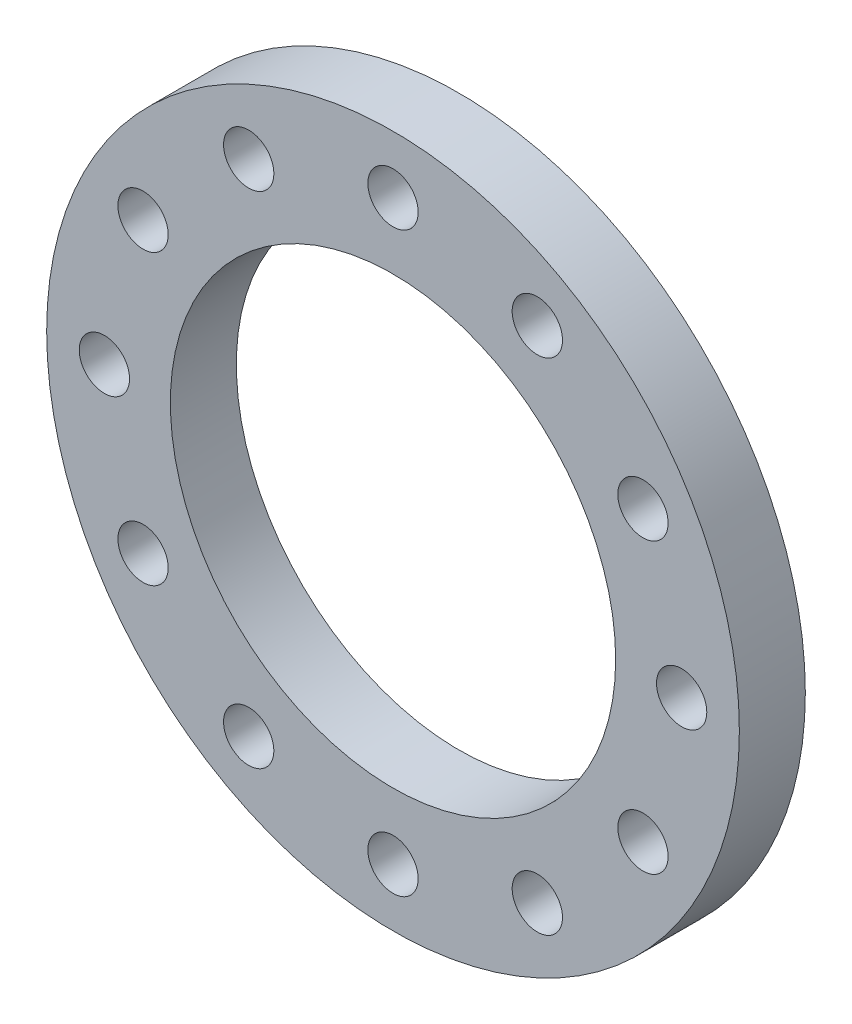
ISO-10303-21;
HEADER;
FILE_DESCRIPTION(('STEP AP214'),'2;1');
FILE_NAME('part.step','',(''),(''),'','','');
FILE_SCHEMA(('AUTOMOTIVE_DESIGN { 1 0 10303 214 1 1 1 1 }'));
ENDSEC;
DATA;
#1=APPLICATION_CONTEXT('core data for automotive mechanical design processes');
#2=APPLICATION_PROTOCOL_DEFINITION('international standard','automotive_design',2000,#1);
#3=PRODUCT_CONTEXT('',#1,'mechanical');
#4=PRODUCT('Part','Part','',(#3));
#5=PRODUCT_RELATED_PRODUCT_CATEGORY('part','',(#4));
#6=PRODUCT_DEFINITION_FORMATION('','',#4);
#7=PRODUCT_DEFINITION_CONTEXT('part definition',#1,'design');
#8=PRODUCT_DEFINITION('design','',#6,#7);
#9=PRODUCT_DEFINITION_SHAPE('','',#8);
#10=(LENGTH_UNIT() NAMED_UNIT(*) SI_UNIT(.MILLI.,.METRE.));
#11=(NAMED_UNIT(*) PLANE_ANGLE_UNIT() SI_UNIT($,.RADIAN.));
#12=(NAMED_UNIT(*) SI_UNIT($,.STERADIAN.) SOLID_ANGLE_UNIT());
#13=UNCERTAINTY_MEASURE_WITH_UNIT(LENGTH_MEASURE(1.E-05),#10,'distance_accuracy_value','');
#14=(GEOMETRIC_REPRESENTATION_CONTEXT(3) GLOBAL_UNCERTAINTY_ASSIGNED_CONTEXT((#13)) GLOBAL_UNIT_ASSIGNED_CONTEXT((#10,
#11,#12)) REPRESENTATION_CONTEXT('',''));
#15=CARTESIAN_POINT('',(0.,0.,0.));
#16=DIRECTION('',(0.,0.,1.));
#17=DIRECTION('',(1.,0.,0.));
#18=AXIS2_PLACEMENT_3D('',#15,#16,#17);
#19=CARTESIAN_POINT('',(0.,0.,4.));
#20=DIRECTION('',(0.,0.,1.));
#21=DIRECTION('',(1.,0.,0.));
#22=AXIS2_PLACEMENT_3D('',#19,#20,#21);
#23=PLANE('',#22);
#24=CARTESIAN_POINT('',(15.1554445662292,8.74999999999743,4.));
#25=DIRECTION('',(0.,0.,1.));
#26=DIRECTION('',(1.,0.,0.));
#27=AXIS2_PLACEMENT_3D('',#24,#25,#26);
#28=CIRCLE('',#27,1.525);
#29=CARTESIAN_POINT('',(16.6804445662292,8.74999999999743,4.));
#30=VERTEX_POINT('',#29);
#31=EDGE_CURVE('E133',#30,#30,#28,.T.);
#32=ORIENTED_EDGE('',*,*,#31,.F.);
#33=EDGE_LOOP('',(#32));
#34=FACE_BOUND('',#33,.T.);
#35=CARTESIAN_POINT('',(-15.1554445662262,-8.75000000000258,4.));
#36=DIRECTION('',(0.,0.,1.));
#37=DIRECTION('',(1.,0.,0.));
#38=AXIS2_PLACEMENT_3D('',#35,#36,#37);
#39=CIRCLE('',#38,1.525);
#40=CARTESIAN_POINT('',(-13.6304445662262,-8.75000000000258,4.));
#41=VERTEX_POINT('',#40);
#42=EDGE_CURVE('E118',#41,#41,#39,.T.);
#43=ORIENTED_EDGE('',*,*,#42,.F.);
#44=EDGE_LOOP('',(#43));
#45=FACE_BOUND('',#44,.T.);
#46=CARTESIAN_POINT('',(-15.1554445662247,8.75,4.));
#47=DIRECTION('',(0.,0.,1.));
#48=DIRECTION('',(1.,0.,0.));
#49=AXIS2_PLACEMENT_3D('',#46,#47,#48);
#50=CIRCLE('',#49,1.525);
#51=CARTESIAN_POINT('',(-13.6304445662247,8.75,4.));
#52=VERTEX_POINT('',#51);
#53=EDGE_CURVE('E111',#52,#52,#50,.T.);
#54=ORIENTED_EDGE('',*,*,#53,.F.);
#55=EDGE_LOOP('',(#54));
#56=FACE_BOUND('',#55,.T.);
#57=CARTESIAN_POINT('',(15.1554445662306,-8.75,4.));
#58=DIRECTION('',(0.,0.,1.));
#59=DIRECTION('',(1.,0.,0.));
#60=AXIS2_PLACEMENT_3D('',#57,#58,#59);
#61=CIRCLE('',#60,1.525);
#62=CARTESIAN_POINT('',(16.6804445662306,-8.75,4.));
#63=VERTEX_POINT('',#62);
#64=EDGE_CURVE('E91',#63,#63,#61,.T.);
#65=ORIENTED_EDGE('',*,*,#64,.F.);
#66=EDGE_LOOP('',(#65));
#67=FACE_BOUND('',#66,.T.);
#68=CARTESIAN_POINT('',(0.,-17.5,4.));
#69=DIRECTION('',(0.,0.,1.));
#70=DIRECTION('',(1.,0.,0.));
#71=AXIS2_PLACEMENT_3D('',#68,#69,#70);
#72=CIRCLE('',#71,1.525);
#73=CARTESIAN_POINT('',(1.525,-17.5,4.));
#74=VERTEX_POINT('',#73);
#75=EDGE_CURVE('E73',#74,#74,#72,.T.);
#76=ORIENTED_EDGE('',*,*,#75,.F.);
#77=EDGE_LOOP('',(#76));
#78=FACE_BOUND('',#77,.T.);
#79=CARTESIAN_POINT('',(0.,17.5,4.));
#80=DIRECTION('',(0.,0.,1.));
#81=DIRECTION('',(1.,0.,0.));
#82=AXIS2_PLACEMENT_3D('',#79,#80,#81);
#83=CIRCLE('',#82,1.525);
#84=CARTESIAN_POINT('',(1.525,17.5,4.));
#85=VERTEX_POINT('',#84);
#86=EDGE_CURVE('E66',#85,#85,#83,.T.);
#87=ORIENTED_EDGE('',*,*,#86,.F.);
#88=EDGE_LOOP('',(#87));
#89=FACE_BOUND('',#88,.T.);
#90=CARTESIAN_POINT('',(0.,0.,4.));
#91=DIRECTION('',(0.,0.,1.));
#92=DIRECTION('',(1.,0.,0.));
#93=AXIS2_PLACEMENT_3D('',#90,#91,#92);
#94=CIRCLE('',#93,21.);
#95=CARTESIAN_POINT('',(21.,0.,4.));
#96=VERTEX_POINT('',#95);
#97=EDGE_CURVE('E11',#96,#96,#94,.T.);
#98=ORIENTED_EDGE('',*,*,#97,.T.);
#99=EDGE_LOOP('',(#98));
#100=FACE_BOUND('',#99,.T.);
#101=CARTESIAN_POINT('',(0.,0.,4.));
#102=DIRECTION('',(0.,0.,1.));
#103=DIRECTION('',(1.,0.,0.));
#104=AXIS2_PLACEMENT_3D('',#101,#102,#103);
#105=CIRCLE('',#104,13.5);
#106=CARTESIAN_POINT('',(13.5,0.,4.));
#107=VERTEX_POINT('',#106);
#108=EDGE_CURVE('E48',#107,#107,#105,.T.);
#109=ORIENTED_EDGE('',*,*,#108,.F.);
#110=EDGE_LOOP('',(#109));
#111=FACE_BOUND('',#110,.T.);
#112=CARTESIAN_POINT('',(17.5,0.,4.));
#113=DIRECTION('',(0.,0.,1.));
#114=DIRECTION('',(1.,0.,0.));
#115=AXIS2_PLACEMENT_3D('',#112,#113,#114);
#116=CIRCLE('',#115,1.525);
#117=CARTESIAN_POINT('',(19.025,0.,4.));
#118=VERTEX_POINT('',#117);
#119=EDGE_CURVE('E67',#118,#118,#116,.T.);
#120=ORIENTED_EDGE('',*,*,#119,.F.);
#121=EDGE_LOOP('',(#120));
#122=FACE_BOUND('',#121,.T.);
#123=CARTESIAN_POINT('',(-17.5,0.,4.));
#124=DIRECTION('',(0.,0.,1.));
#125=DIRECTION('',(1.,0.,0.));
#126=AXIS2_PLACEMENT_3D('',#123,#124,#125);
#127=CIRCLE('',#126,1.525);
#128=CARTESIAN_POINT('',(-15.975,0.,4.));
#129=VERTEX_POINT('',#128);
#130=EDGE_CURVE('E80',#129,#129,#127,.T.);
#131=ORIENTED_EDGE('',*,*,#130,.F.);
#132=EDGE_LOOP('',(#131));
#133=FACE_BOUND('',#132,.T.);
#134=CARTESIAN_POINT('',(-8.74999999999703,-15.1554445662277,4.));
#135=DIRECTION('',(0.,0.,1.));
#136=DIRECTION('',(1.,0.,0.));
#137=AXIS2_PLACEMENT_3D('',#134,#135,#136);
#138=CIRCLE('',#137,1.525);
#139=CARTESIAN_POINT('',(-7.22499999999703,-15.1554445662277,4.));
#140=VERTEX_POINT('',#139);
#141=EDGE_CURVE('E100',#140,#140,#138,.T.);
#142=ORIENTED_EDGE('',*,*,#141,.F.);
#143=EDGE_LOOP('',(#142));
#144=FACE_BOUND('',#143,.T.);
#145=CARTESIAN_POINT('',(8.75000000000297,15.1554445662277,4.));
#146=DIRECTION('',(0.,0.,1.));
#147=DIRECTION('',(1.,0.,0.));
#148=AXIS2_PLACEMENT_3D('',#145,#146,#147);
#149=CIRCLE('',#148,1.525);
#150=CARTESIAN_POINT('',(10.275000000003,15.1554445662277,4.));
#151=VERTEX_POINT('',#150);
#152=EDGE_CURVE('E112',#151,#151,#149,.T.);
#153=ORIENTED_EDGE('',*,*,#152,.F.);
#154=EDGE_LOOP('',(#153));
#155=FACE_BOUND('',#154,.T.);
#156=CARTESIAN_POINT('',(-8.74999999999852,15.1554445662251,4.));
#157=DIRECTION('',(0.,0.,1.));
#158=DIRECTION('',(1.,0.,0.));
#159=AXIS2_PLACEMENT_3D('',#156,#157,#158);
#160=CIRCLE('',#159,1.525);
#161=CARTESIAN_POINT('',(-7.22499999999852,15.1554445662251,4.));
#162=VERTEX_POINT('',#161);
#163=EDGE_CURVE('E125',#162,#162,#160,.T.);
#164=ORIENTED_EDGE('',*,*,#163,.F.);
#165=EDGE_LOOP('',(#164));
#166=FACE_BOUND('',#165,.T.);
#167=CARTESIAN_POINT('',(8.75000000000149,-15.1554445662302,4.));
#168=DIRECTION('',(0.,0.,1.));
#169=DIRECTION('',(1.,0.,0.));
#170=AXIS2_PLACEMENT_3D('',#167,#168,#169);
#171=CIRCLE('',#170,1.525);
#172=CARTESIAN_POINT('',(10.2750000000015,-15.1554445662302,4.));
#173=VERTEX_POINT('',#172);
#174=EDGE_CURVE('E141',#173,#173,#171,.T.);
#175=ORIENTED_EDGE('',*,*,#174,.F.);
#176=EDGE_LOOP('',(#175));
#177=FACE_BOUND('',#176,.T.);
#178=ADVANCED_FACE('F37',(#34,#45,#56,#67,#78,#89,#100,#111,#122,#133,#144,#155,#166,#177),#23,.T.);
#179=CARTESIAN_POINT('',(0.,0.,0.));
#180=DIRECTION('',(0.,0.,1.));
#181=DIRECTION('',(1.,0.,0.));
#182=AXIS2_PLACEMENT_3D('',#179,#180,#181);
#183=PLANE('',#182);
#184=CARTESIAN_POINT('',(0.,0.,0.));
#185=DIRECTION('',(0.,0.,1.));
#186=DIRECTION('',(1.,0.,0.));
#187=AXIS2_PLACEMENT_3D('',#184,#185,#186);
#188=CIRCLE('',#187,21.);
#189=CARTESIAN_POINT('',(21.,0.,0.));
#190=VERTEX_POINT('',#189);
#191=EDGE_CURVE('E41',#190,#190,#188,.T.);
#192=ORIENTED_EDGE('',*,*,#191,.F.);
#193=EDGE_LOOP('',(#192));
#194=FACE_BOUND('',#193,.T.);
#195=CARTESIAN_POINT('',(0.,0.,0.));
#196=DIRECTION('',(0.,0.,1.));
#197=DIRECTION('',(1.,0.,0.));
#198=AXIS2_PLACEMENT_3D('',#195,#196,#197);
#199=CIRCLE('',#198,13.5);
#200=CARTESIAN_POINT('',(13.5,0.,0.));
#201=VERTEX_POINT('',#200);
#202=EDGE_CURVE('E51',#201,#201,#199,.T.);
#203=ORIENTED_EDGE('',*,*,#202,.T.);
#204=EDGE_LOOP('',(#203));
#205=FACE_BOUND('',#204,.T.);
#206=CARTESIAN_POINT('',(0.,17.5,0.));
#207=DIRECTION('',(0.,0.,1.));
#208=DIRECTION('',(1.,0.,0.));
#209=AXIS2_PLACEMENT_3D('',#206,#207,#208);
#210=CIRCLE('',#209,1.525);
#211=CARTESIAN_POINT('',(1.525,17.5,0.));
#212=VERTEX_POINT('',#211);
#213=EDGE_CURVE('E64',#212,#212,#210,.T.);
#214=ORIENTED_EDGE('',*,*,#213,.T.);
#215=EDGE_LOOP('',(#214));
#216=FACE_BOUND('',#215,.T.);
#217=CARTESIAN_POINT('',(17.5,0.,0.));
#218=DIRECTION('',(0.,0.,1.));
#219=DIRECTION('',(1.,0.,0.));
#220=AXIS2_PLACEMENT_3D('',#217,#218,#219);
#221=CIRCLE('',#220,1.525);
#222=CARTESIAN_POINT('',(19.025,0.,0.));
#223=VERTEX_POINT('',#222);
#224=EDGE_CURVE('E71',#223,#223,#221,.T.);
#225=ORIENTED_EDGE('',*,*,#224,.T.);
#226=EDGE_LOOP('',(#225));
#227=FACE_BOUND('',#226,.T.);
#228=CARTESIAN_POINT('',(0.,-17.5,0.));
#229=DIRECTION('',(0.,0.,1.));
#230=DIRECTION('',(1.,0.,0.));
#231=AXIS2_PLACEMENT_3D('',#228,#229,#230);
#232=CIRCLE('',#231,1.525);
#233=CARTESIAN_POINT('',(1.525,-17.5,0.));
#234=VERTEX_POINT('',#233);
#235=EDGE_CURVE('E77',#234,#234,#232,.T.);
#236=ORIENTED_EDGE('',*,*,#235,.T.);
#237=EDGE_LOOP('',(#236));
#238=FACE_BOUND('',#237,.T.);
#239=CARTESIAN_POINT('',(-17.5,0.,0.));
#240=DIRECTION('',(0.,0.,1.));
#241=DIRECTION('',(1.,0.,0.));
#242=AXIS2_PLACEMENT_3D('',#239,#240,#241);
#243=CIRCLE('',#242,1.525);
#244=CARTESIAN_POINT('',(-15.975,0.,0.));
#245=VERTEX_POINT('',#244);
#246=EDGE_CURVE('E84',#245,#245,#243,.T.);
#247=ORIENTED_EDGE('',*,*,#246,.T.);
#248=EDGE_LOOP('',(#247));
#249=FACE_BOUND('',#248,.T.);
#250=CARTESIAN_POINT('',(15.1554445662306,-8.75,0.));
#251=DIRECTION('',(0.,0.,1.));
#252=DIRECTION('',(1.,0.,0.));
#253=AXIS2_PLACEMENT_3D('',#250,#251,#252);
#254=CIRCLE('',#253,1.525);
#255=CARTESIAN_POINT('',(16.6804445662306,-8.75,0.));
#256=VERTEX_POINT('',#255);
#257=EDGE_CURVE('E96',#256,#256,#254,.T.);
#258=ORIENTED_EDGE('',*,*,#257,.T.);
#259=EDGE_LOOP('',(#258));
#260=FACE_BOUND('',#259,.T.);
#261=CARTESIAN_POINT('',(-8.74999999999703,-15.1554445662277,0.));
#262=DIRECTION('',(0.,0.,1.));
#263=DIRECTION('',(1.,0.,0.));
#264=AXIS2_PLACEMENT_3D('',#261,#262,#263);
#265=CIRCLE('',#264,1.525);
#266=CARTESIAN_POINT('',(-7.22499999999703,-15.1554445662277,0.));
#267=VERTEX_POINT('',#266);
#268=EDGE_CURVE('E97',#267,#267,#265,.T.);
#269=ORIENTED_EDGE('',*,*,#268,.T.);
#270=EDGE_LOOP('',(#269));
#271=FACE_BOUND('',#270,.T.);
#272=CARTESIAN_POINT('',(-15.1554445662247,8.75,0.));
#273=DIRECTION('',(0.,0.,1.));
#274=DIRECTION('',(1.,0.,0.));
#275=AXIS2_PLACEMENT_3D('',#272,#273,#274);
#276=CIRCLE('',#275,1.525);
#277=CARTESIAN_POINT('',(-13.6304445662247,8.75,0.));
#278=VERTEX_POINT('',#277);
#279=EDGE_CURVE('E109',#278,#278,#276,.T.);
#280=ORIENTED_EDGE('',*,*,#279,.T.);
#281=EDGE_LOOP('',(#280));
#282=FACE_BOUND('',#281,.T.);
#283=CARTESIAN_POINT('',(8.75000000000297,15.1554445662277,0.));
#284=DIRECTION('',(0.,0.,1.));
#285=DIRECTION('',(1.,0.,0.));
#286=AXIS2_PLACEMENT_3D('',#283,#284,#285);
#287=CIRCLE('',#286,1.525);
#288=CARTESIAN_POINT('',(10.275000000003,15.1554445662277,0.));
#289=VERTEX_POINT('',#288);
#290=EDGE_CURVE('E116',#289,#289,#287,.T.);
#291=ORIENTED_EDGE('',*,*,#290,.T.);
#292=EDGE_LOOP('',(#291));
#293=FACE_BOUND('',#292,.T.);
#294=CARTESIAN_POINT('',(-15.1554445662262,-8.75000000000258,0.));
#295=DIRECTION('',(0.,0.,1.));
#296=DIRECTION('',(1.,0.,0.));
#297=AXIS2_PLACEMENT_3D('',#294,#295,#296);
#298=CIRCLE('',#297,1.525);
#299=CARTESIAN_POINT('',(-13.6304445662262,-8.75000000000258,0.));
#300=VERTEX_POINT('',#299);
#301=EDGE_CURVE('E122',#300,#300,#298,.T.);
#302=ORIENTED_EDGE('',*,*,#301,.T.);
#303=EDGE_LOOP('',(#302));
#304=FACE_BOUND('',#303,.T.);
#305=CARTESIAN_POINT('',(-8.74999999999852,15.1554445662251,0.));
#306=DIRECTION('',(0.,0.,1.));
#307=DIRECTION('',(1.,0.,0.));
#308=AXIS2_PLACEMENT_3D('',#305,#306,#307);
#309=CIRCLE('',#308,1.525);
#310=CARTESIAN_POINT('',(-7.22499999999852,15.1554445662251,0.));
#311=VERTEX_POINT('',#310);
#312=EDGE_CURVE('E129',#311,#311,#309,.T.);
#313=ORIENTED_EDGE('',*,*,#312,.T.);
#314=EDGE_LOOP('',(#313));
#315=FACE_BOUND('',#314,.T.);
#316=CARTESIAN_POINT('',(15.1554445662292,8.74999999999743,0.));
#317=DIRECTION('',(0.,0.,1.));
#318=DIRECTION('',(1.,0.,0.));
#319=AXIS2_PLACEMENT_3D('',#316,#317,#318);
#320=CIRCLE('',#319,1.525);
#321=CARTESIAN_POINT('',(16.6804445662292,8.74999999999743,0.));
#322=VERTEX_POINT('',#321);
#323=EDGE_CURVE('E138',#322,#322,#320,.T.);
#324=ORIENTED_EDGE('',*,*,#323,.T.);
#325=EDGE_LOOP('',(#324));
#326=FACE_BOUND('',#325,.T.);
#327=CARTESIAN_POINT('',(8.75000000000149,-15.1554445662302,0.));
#328=DIRECTION('',(0.,0.,1.));
#329=DIRECTION('',(1.,0.,0.));
#330=AXIS2_PLACEMENT_3D('',#327,#328,#329);
#331=CIRCLE('',#330,1.525);
#332=CARTESIAN_POINT('',(10.2750000000015,-15.1554445662302,0.));
#333=VERTEX_POINT('',#332);
#334=EDGE_CURVE('E139',#333,#333,#331,.T.);
#335=ORIENTED_EDGE('',*,*,#334,.T.);
#336=EDGE_LOOP('',(#335));
#337=FACE_BOUND('',#336,.T.);
#338=ADVANCED_FACE('F149',(#194,#205,#216,#227,#238,#249,#260,#271,#282,#293,#304,#315,#326,
#337),#183,.F.);
#339=CARTESIAN_POINT('',(0.,0.,4.));
#340=DIRECTION('',(0.,0.,-1.));
#341=DIRECTION('',(-1.,0.,0.));
#342=AXIS2_PLACEMENT_3D('',#339,#340,#341);
#343=CYLINDRICAL_SURFACE('',#342,21.);
#344=ORIENTED_EDGE('',*,*,#97,.F.);
#345=EDGE_LOOP('',(#344));
#346=FACE_BOUND('',#345,.T.);
#347=ORIENTED_EDGE('',*,*,#191,.T.);
#348=EDGE_LOOP('',(#347));
#349=FACE_BOUND('',#348,.T.);
#350=ADVANCED_FACE('F39',(#346,#349),#343,.T.);
#351=CARTESIAN_POINT('',(0.,0.,4.));
#352=DIRECTION('',(0.,0.,-1.));
#353=DIRECTION('',(-1.,0.,0.));
#354=AXIS2_PLACEMENT_3D('',#351,#352,#353);
#355=CYLINDRICAL_SURFACE('',#354,13.5);
#356=ORIENTED_EDGE('',*,*,#108,.T.);
#357=EDGE_LOOP('',(#356));
#358=FACE_BOUND('',#357,.T.);
#359=ORIENTED_EDGE('',*,*,#202,.F.);
#360=EDGE_LOOP('',(#359));
#361=FACE_BOUND('',#360,.T.);
#362=ADVANCED_FACE('F177',(#358,#361),#355,.F.);
#363=CARTESIAN_POINT('',(0.,17.5,4.));
#364=DIRECTION('',(0.,0.,-1.));
#365=DIRECTION('',(-1.,0.,0.));
#366=AXIS2_PLACEMENT_3D('',#363,#364,#365);
#367=CYLINDRICAL_SURFACE('',#366,1.525);
#368=ORIENTED_EDGE('',*,*,#86,.T.);
#369=EDGE_LOOP('',(#368));
#370=FACE_BOUND('',#369,.T.);
#371=ORIENTED_EDGE('',*,*,#213,.F.);
#372=EDGE_LOOP('',(#371));
#373=FACE_BOUND('',#372,.T.);
#374=ADVANCED_FACE('F180',(#370,#373),#367,.F.);
#375=CARTESIAN_POINT('',(17.5,0.,4.));
#376=DIRECTION('',(0.,0.,-1.));
#377=DIRECTION('',(-1.,0.,0.));
#378=AXIS2_PLACEMENT_3D('',#375,#376,#377);
#379=CYLINDRICAL_SURFACE('',#378,1.525);
#380=ORIENTED_EDGE('',*,*,#119,.T.);
#381=EDGE_LOOP('',(#380));
#382=FACE_BOUND('',#381,.T.);
#383=ORIENTED_EDGE('',*,*,#224,.F.);
#384=EDGE_LOOP('',(#383));
#385=FACE_BOUND('',#384,.T.);
#386=ADVANCED_FACE('F184',(#382,#385),#379,.F.);
#387=CARTESIAN_POINT('',(0.,-17.5,4.));
#388=DIRECTION('',(0.,0.,-1.));
#389=DIRECTION('',(-1.,0.,0.));
#390=AXIS2_PLACEMENT_3D('',#387,#388,#389);
#391=CYLINDRICAL_SURFACE('',#390,1.525);
#392=ORIENTED_EDGE('',*,*,#75,.T.);
#393=EDGE_LOOP('',(#392));
#394=FACE_BOUND('',#393,.T.);
#395=ORIENTED_EDGE('',*,*,#235,.F.);
#396=EDGE_LOOP('',(#395));
#397=FACE_BOUND('',#396,.T.);
#398=ADVANCED_FACE('F188',(#394,#397),#391,.F.);
#399=CARTESIAN_POINT('',(-17.5,0.,4.));
#400=DIRECTION('',(0.,0.,-1.));
#401=DIRECTION('',(-1.,0.,0.));
#402=AXIS2_PLACEMENT_3D('',#399,#400,#401);
#403=CYLINDRICAL_SURFACE('',#402,1.525);
#404=ORIENTED_EDGE('',*,*,#130,.T.);
#405=EDGE_LOOP('',(#404));
#406=FACE_BOUND('',#405,.T.);
#407=ORIENTED_EDGE('',*,*,#246,.F.);
#408=EDGE_LOOP('',(#407));
#409=FACE_BOUND('',#408,.T.);
#410=ADVANCED_FACE('F192',(#406,#409),#403,.F.);
#411=CARTESIAN_POINT('',(15.1554445662306,-8.75,4.));
#412=DIRECTION('',(0.,0.,-1.));
#413=DIRECTION('',(-1.,0.,0.));
#414=AXIS2_PLACEMENT_3D('',#411,#412,#413);
#415=CYLINDRICAL_SURFACE('',#414,1.525);
#416=ORIENTED_EDGE('',*,*,#64,.T.);
#417=EDGE_LOOP('',(#416));
#418=FACE_BOUND('',#417,.T.);
#419=ORIENTED_EDGE('',*,*,#257,.F.);
#420=EDGE_LOOP('',(#419));
#421=FACE_BOUND('',#420,.T.);
#422=ADVANCED_FACE('F196',(#418,#421),#415,.F.);
#423=CARTESIAN_POINT('',(-8.74999999999703,-15.1554445662277,4.));
#424=DIRECTION('',(0.,0.,-1.));
#425=DIRECTION('',(-1.,0.,0.));
#426=AXIS2_PLACEMENT_3D('',#423,#424,#425);
#427=CYLINDRICAL_SURFACE('',#426,1.525);
#428=ORIENTED_EDGE('',*,*,#141,.T.);
#429=EDGE_LOOP('',(#428));
#430=FACE_BOUND('',#429,.T.);
#431=ORIENTED_EDGE('',*,*,#268,.F.);
#432=EDGE_LOOP('',(#431));
#433=FACE_BOUND('',#432,.T.);
#434=ADVANCED_FACE('F200',(#430,#433),#427,.F.);
#435=CARTESIAN_POINT('',(-15.1554445662247,8.75,4.));
#436=DIRECTION('',(0.,0.,-1.));
#437=DIRECTION('',(-1.,0.,0.));
#438=AXIS2_PLACEMENT_3D('',#435,#436,#437);
#439=CYLINDRICAL_SURFACE('',#438,1.525);
#440=ORIENTED_EDGE('',*,*,#53,.T.);
#441=EDGE_LOOP('',(#440));
#442=FACE_BOUND('',#441,.T.);
#443=ORIENTED_EDGE('',*,*,#279,.F.);
#444=EDGE_LOOP('',(#443));
#445=FACE_BOUND('',#444,.T.);
#446=ADVANCED_FACE('F204',(#442,#445),#439,.F.);
#447=CARTESIAN_POINT('',(8.75000000000297,15.1554445662277,4.));
#448=DIRECTION('',(0.,0.,-1.));
#449=DIRECTION('',(-1.,0.,0.));
#450=AXIS2_PLACEMENT_3D('',#447,#448,#449);
#451=CYLINDRICAL_SURFACE('',#450,1.525);
#452=ORIENTED_EDGE('',*,*,#152,.T.);
#453=EDGE_LOOP('',(#452));
#454=FACE_BOUND('',#453,.T.);
#455=ORIENTED_EDGE('',*,*,#290,.F.);
#456=EDGE_LOOP('',(#455));
#457=FACE_BOUND('',#456,.T.);
#458=ADVANCED_FACE('F164',(#454,#457),#451,.F.);
#459=CARTESIAN_POINT('',(-15.1554445662262,-8.75000000000258,4.));
#460=DIRECTION('',(0.,0.,-1.));
#461=DIRECTION('',(-1.,0.,0.));
#462=AXIS2_PLACEMENT_3D('',#459,#460,#461);
#463=CYLINDRICAL_SURFACE('',#462,1.525);
#464=ORIENTED_EDGE('',*,*,#42,.T.);
#465=EDGE_LOOP('',(#464));
#466=FACE_BOUND('',#465,.T.);
#467=ORIENTED_EDGE('',*,*,#301,.F.);
#468=EDGE_LOOP('',(#467));
#469=FACE_BOUND('',#468,.T.);
#470=ADVANCED_FACE('F155',(#466,#469),#463,.F.);
#471=CARTESIAN_POINT('',(-8.74999999999852,15.1554445662251,4.));
#472=DIRECTION('',(0.,0.,-1.));
#473=DIRECTION('',(-1.,0.,0.));
#474=AXIS2_PLACEMENT_3D('',#471,#472,#473);
#475=CYLINDRICAL_SURFACE('',#474,1.525);
#476=ORIENTED_EDGE('',*,*,#163,.T.);
#477=EDGE_LOOP('',(#476));
#478=FACE_BOUND('',#477,.T.);
#479=ORIENTED_EDGE('',*,*,#312,.F.);
#480=EDGE_LOOP('',(#479));
#481=FACE_BOUND('',#480,.T.);
#482=ADVANCED_FACE('F152',(#478,#481),#475,.F.);
#483=CARTESIAN_POINT('',(15.1554445662292,8.74999999999743,4.));
#484=DIRECTION('',(0.,0.,-1.));
#485=DIRECTION('',(-1.,0.,0.));
#486=AXIS2_PLACEMENT_3D('',#483,#484,#485);
#487=CYLINDRICAL_SURFACE('',#486,1.525);
#488=ORIENTED_EDGE('',*,*,#31,.T.);
#489=EDGE_LOOP('',(#488));
#490=FACE_BOUND('',#489,.T.);
#491=ORIENTED_EDGE('',*,*,#323,.F.);
#492=EDGE_LOOP('',(#491));
#493=FACE_BOUND('',#492,.T.);
#494=ADVANCED_FACE('F154',(#490,#493),#487,.F.);
#495=CARTESIAN_POINT('',(8.75000000000149,-15.1554445662302,4.));
#496=DIRECTION('',(0.,0.,-1.));
#497=DIRECTION('',(-1.,0.,0.));
#498=AXIS2_PLACEMENT_3D('',#495,#496,#497);
#499=CYLINDRICAL_SURFACE('',#498,1.525);
#500=ORIENTED_EDGE('',*,*,#174,.T.);
#501=EDGE_LOOP('',(#500));
#502=FACE_BOUND('',#501,.T.);
#503=ORIENTED_EDGE('',*,*,#334,.F.);
#504=EDGE_LOOP('',(#503));
#505=FACE_BOUND('',#504,.T.);
#506=ADVANCED_FACE('F161',(#502,#505),#499,.F.);
#507=CLOSED_SHELL('',(#178,#338,#350,#362,#374,#386,#398,#410,#422,#434,#446,#458,#470,#482,
#494,#506));
#508=MANIFOLD_SOLID_BREP('B2',#507);
#509=ADVANCED_BREP_SHAPE_REPRESENTATION('',(#18,#508),#14);
#510=SHAPE_DEFINITION_REPRESENTATION(#9,#509);
ENDSEC;
END-ISO-10303-21;
